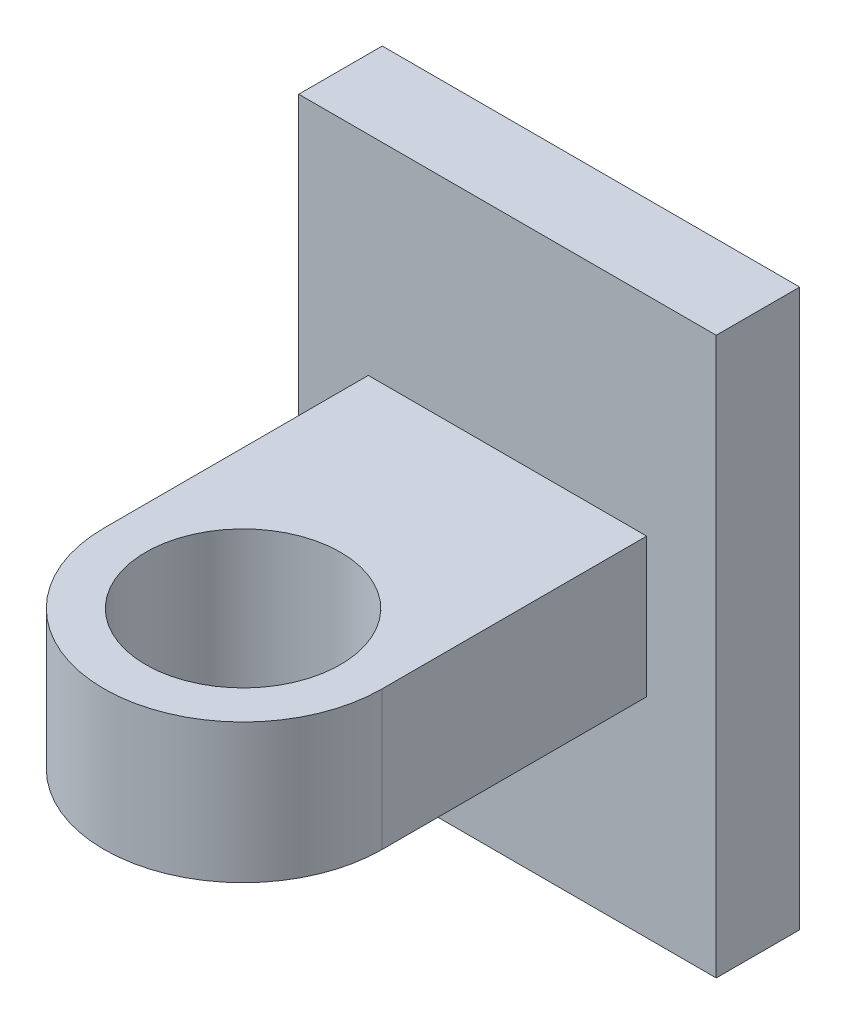
ISO-10303-21;
HEADER;
FILE_DESCRIPTION(('STEP AP214'),'2;1');
FILE_NAME('part.step','',(''),(''),'','','');
FILE_SCHEMA(('AUTOMOTIVE_DESIGN { 1 0 10303 214 1 1 1 1 }'));
ENDSEC;
DATA;
#1=APPLICATION_CONTEXT('core data for automotive mechanical design processes');
#2=APPLICATION_PROTOCOL_DEFINITION('international standard','automotive_design',2000,#1);
#3=PRODUCT_CONTEXT('',#1,'mechanical');
#4=PRODUCT('Part','Part','',(#3));
#5=PRODUCT_RELATED_PRODUCT_CATEGORY('part','',(#4));
#6=PRODUCT_DEFINITION_FORMATION('','',#4);
#7=PRODUCT_DEFINITION_CONTEXT('part definition',#1,'design');
#8=PRODUCT_DEFINITION('design','',#6,#7);
#9=PRODUCT_DEFINITION_SHAPE('','',#8);
#10=(LENGTH_UNIT() NAMED_UNIT(*) SI_UNIT(.MILLI.,.METRE.));
#11=(NAMED_UNIT(*) PLANE_ANGLE_UNIT() SI_UNIT($,.RADIAN.));
#12=(NAMED_UNIT(*) SI_UNIT($,.STERADIAN.) SOLID_ANGLE_UNIT());
#13=UNCERTAINTY_MEASURE_WITH_UNIT(LENGTH_MEASURE(1.E-05),#10,'distance_accuracy_value','');
#14=(GEOMETRIC_REPRESENTATION_CONTEXT(3) GLOBAL_UNCERTAINTY_ASSIGNED_CONTEXT((#13)) GLOBAL_UNIT_ASSIGNED_CONTEXT((#10,
#11,#12)) REPRESENTATION_CONTEXT('',''));
#15=CARTESIAN_POINT('',(0.,0.,0.));
#16=DIRECTION('',(0.,0.,1.));
#17=DIRECTION('',(1.,0.,0.));
#18=AXIS2_PLACEMENT_3D('',#15,#16,#17);
#19=CARTESIAN_POINT('',(0.,0.,3.));
#20=DIRECTION('',(0.,0.,1.));
#21=DIRECTION('',(1.,0.,0.));
#22=AXIS2_PLACEMENT_3D('',#19,#20,#21);
#23=PLANE('',#22);
#24=DIRECTION('',(0.,1.,0.));
#25=VECTOR('',#24,1.);
#26=CARTESIAN_POINT('',(7.5,10.,3.));
#27=LINE('',#26,#25);
#28=CARTESIAN_POINT('',(7.5,-10.,3.));
#29=VERTEX_POINT('',#28);
#30=CARTESIAN_POINT('',(7.5,10.,3.));
#31=VERTEX_POINT('',#30);
#32=EDGE_CURVE('E153',#29,#31,#27,.T.);
#33=ORIENTED_EDGE('',*,*,#32,.T.);
#34=DIRECTION('',(-1.,0.,0.));
#35=VECTOR('',#34,1.);
#36=CARTESIAN_POINT('',(-7.50000000000001,10.,3.));
#37=LINE('',#36,#35);
#38=CARTESIAN_POINT('',(-7.50000000000001,10.,3.));
#39=VERTEX_POINT('',#38);
#40=EDGE_CURVE('E92',#31,#39,#37,.T.);
#41=ORIENTED_EDGE('',*,*,#40,.T.);
#42=DIRECTION('',(0.,-1.,0.));
#43=VECTOR('',#42,1.);
#44=CARTESIAN_POINT('',(-7.50000000000001,10.,3.));
#45=LINE('',#44,#43);
#46=CARTESIAN_POINT('',(-7.5,-10.,3.));
#47=VERTEX_POINT('',#46);
#48=EDGE_CURVE('E158',#39,#47,#45,.T.);
#49=ORIENTED_EDGE('',*,*,#48,.T.);
#50=DIRECTION('',(1.,0.,0.));
#51=VECTOR('',#50,1.);
#52=CARTESIAN_POINT('',(-7.5,-10.,3.));
#53=LINE('',#52,#51);
#54=EDGE_CURVE('E64',#47,#29,#53,.T.);
#55=ORIENTED_EDGE('',*,*,#54,.T.);
#56=EDGE_LOOP('',(#33,#41,#49,#55));
#57=FACE_BOUND('',#56,.T.);
#58=DIRECTION('',(0.,-1.,0.));
#59=VECTOR('',#58,1.);
#60=CARTESIAN_POINT('',(5.,2.5,3.));
#61=LINE('',#60,#59);
#62=CARTESIAN_POINT('',(5.,2.5,3.));
#63=VERTEX_POINT('',#62);
#64=CARTESIAN_POINT('',(5.,-2.5,3.));
#65=VERTEX_POINT('',#64);
#66=EDGE_CURVE('E149',#63,#65,#61,.T.);
#67=ORIENTED_EDGE('',*,*,#66,.T.);
#68=DIRECTION('',(-1.,0.,0.));
#69=VECTOR('',#68,1.);
#70=CARTESIAN_POINT('',(-5.,-2.5,3.));
#71=LINE('',#70,#69);
#72=CARTESIAN_POINT('',(-5.,-2.5,3.));
#73=VERTEX_POINT('',#72);
#74=EDGE_CURVE('E55',#65,#73,#71,.T.);
#75=ORIENTED_EDGE('',*,*,#74,.T.);
#76=DIRECTION('',(0.,-1.,0.));
#77=VECTOR('',#76,1.);
#78=CARTESIAN_POINT('',(-5.,2.5,3.));
#79=LINE('',#78,#77);
#80=CARTESIAN_POINT('',(-5.,2.5,3.));
#81=VERTEX_POINT('',#80);
#82=EDGE_CURVE('E240',#81,#73,#79,.T.);
#83=ORIENTED_EDGE('',*,*,#82,.F.);
#84=DIRECTION('',(-1.,0.,0.));
#85=VECTOR('',#84,1.);
#86=CARTESIAN_POINT('',(-5.,2.5,3.));
#87=LINE('',#86,#85);
#88=EDGE_CURVE('E134',#63,#81,#87,.T.);
#89=ORIENTED_EDGE('',*,*,#88,.F.);
#90=EDGE_LOOP('',(#67,#75,#83,#89));
#91=FACE_BOUND('',#90,.T.);
#92=ADVANCED_FACE('F39',(#57,#91),#23,.T.);
#93=CARTESIAN_POINT('',(7.5,10.,3.));
#94=DIRECTION('',(-1.,0.,0.));
#95=DIRECTION('',(0.,-1.,0.));
#96=AXIS2_PLACEMENT_3D('',#93,#94,#95);
#97=PLANE('',#96);
#98=DIRECTION('',(0.,1.,0.));
#99=VECTOR('',#98,1.);
#100=CARTESIAN_POINT('',(7.5,10.,0.));
#101=LINE('',#100,#99);
#102=CARTESIAN_POINT('',(7.5,-10.,0.));
#103=VERTEX_POINT('',#102);
#104=CARTESIAN_POINT('',(7.5,10.,0.));
#105=VERTEX_POINT('',#104);
#106=EDGE_CURVE('E142',#103,#105,#101,.T.);
#107=ORIENTED_EDGE('',*,*,#106,.T.);
#108=DIRECTION('',(0.,0.,-1.));
#109=VECTOR('',#108,1.);
#110=CARTESIAN_POINT('',(7.5,10.,3.));
#111=LINE('',#110,#109);
#112=EDGE_CURVE('E11',#31,#105,#111,.T.);
#113=ORIENTED_EDGE('',*,*,#112,.F.);
#114=ORIENTED_EDGE('',*,*,#32,.F.);
#115=DIRECTION('',(0.,0.,-1.));
#116=VECTOR('',#115,1.);
#117=CARTESIAN_POINT('',(7.5,-10.,3.));
#118=LINE('',#117,#116);
#119=EDGE_CURVE('E162',#29,#103,#118,.T.);
#120=ORIENTED_EDGE('',*,*,#119,.T.);
#121=EDGE_LOOP('',(#107,#113,#114,#120));
#122=FACE_BOUND('',#121,.T.);
#123=ADVANCED_FACE('F41',(#122),#97,.F.);
#124=CARTESIAN_POINT('',(-7.50000000000001,10.,3.));
#125=DIRECTION('',(0.,-1.,0.));
#126=DIRECTION('',(0.,0.,-1.));
#127=AXIS2_PLACEMENT_3D('',#124,#125,#126);
#128=PLANE('',#127);
#129=DIRECTION('',(-1.,0.,0.));
#130=VECTOR('',#129,1.);
#131=CARTESIAN_POINT('',(-7.50000000000001,10.,0.));
#132=LINE('',#131,#130);
#133=CARTESIAN_POINT('',(-7.50000000000001,10.,0.));
#134=VERTEX_POINT('',#133);
#135=EDGE_CURVE('E147',#105,#134,#132,.T.);
#136=ORIENTED_EDGE('',*,*,#135,.T.);
#137=DIRECTION('',(0.,0.,-1.));
#138=VECTOR('',#137,1.);
#139=CARTESIAN_POINT('',(-7.50000000000001,10.,3.));
#140=LINE('',#139,#138);
#141=EDGE_CURVE('E48',#39,#134,#140,.T.);
#142=ORIENTED_EDGE('',*,*,#141,.F.);
#143=ORIENTED_EDGE('',*,*,#40,.F.);
#144=ORIENTED_EDGE('',*,*,#112,.T.);
#145=EDGE_LOOP('',(#136,#142,#143,#144));
#146=FACE_BOUND('',#145,.T.);
#147=ADVANCED_FACE('F196',(#146),#128,.F.);
#148=CARTESIAN_POINT('',(-7.50000000000001,10.,3.));
#149=DIRECTION('',(1.,0.,0.));
#150=DIRECTION('',(0.,1.,0.));
#151=AXIS2_PLACEMENT_3D('',#148,#149,#150);
#152=PLANE('',#151);
#153=DIRECTION('',(0.,-1.,0.));
#154=VECTOR('',#153,1.);
#155=CARTESIAN_POINT('',(-7.50000000000001,10.,0.));
#156=LINE('',#155,#154);
#157=CARTESIAN_POINT('',(-7.5,-10.,0.));
#158=VERTEX_POINT('',#157);
#159=EDGE_CURVE('E166',#134,#158,#156,.T.);
#160=ORIENTED_EDGE('',*,*,#159,.T.);
#161=DIRECTION('',(0.,0.,-1.));
#162=VECTOR('',#161,1.);
#163=CARTESIAN_POINT('',(-7.5,-10.,3.));
#164=LINE('',#163,#162);
#165=EDGE_CURVE('E173',#47,#158,#164,.T.);
#166=ORIENTED_EDGE('',*,*,#165,.F.);
#167=ORIENTED_EDGE('',*,*,#48,.F.);
#168=ORIENTED_EDGE('',*,*,#141,.T.);
#169=EDGE_LOOP('',(#160,#166,#167,#168));
#170=FACE_BOUND('',#169,.T.);
#171=ADVANCED_FACE('F180',(#170),#152,.F.);
#172=CARTESIAN_POINT('',(-7.5,-10.,3.));
#173=DIRECTION('',(0.,1.,0.));
#174=DIRECTION('',(0.,0.,1.));
#175=AXIS2_PLACEMENT_3D('',#172,#173,#174);
#176=PLANE('',#175);
#177=DIRECTION('',(1.,0.,0.));
#178=VECTOR('',#177,1.);
#179=CARTESIAN_POINT('',(-7.5,-10.,0.));
#180=LINE('',#179,#178);
#181=EDGE_CURVE('E85',#158,#103,#180,.T.);
#182=ORIENTED_EDGE('',*,*,#181,.T.);
#183=ORIENTED_EDGE('',*,*,#119,.F.);
#184=ORIENTED_EDGE('',*,*,#54,.F.);
#185=ORIENTED_EDGE('',*,*,#165,.T.);
#186=EDGE_LOOP('',(#182,#183,#184,#185));
#187=FACE_BOUND('',#186,.T.);
#188=ADVANCED_FACE('F188',(#187),#176,.F.);
#189=CARTESIAN_POINT('',(0.,0.,0.));
#190=DIRECTION('',(0.,0.,1.));
#191=DIRECTION('',(1.,0.,0.));
#192=AXIS2_PLACEMENT_3D('',#189,#190,#191);
#193=PLANE('',#192);
#194=ORIENTED_EDGE('',*,*,#106,.F.);
#195=ORIENTED_EDGE('',*,*,#181,.F.);
#196=ORIENTED_EDGE('',*,*,#159,.F.);
#197=ORIENTED_EDGE('',*,*,#135,.F.);
#198=EDGE_LOOP('',(#194,#195,#196,#197));
#199=FACE_BOUND('',#198,.T.);
#200=ADVANCED_FACE('F184',(#199),#193,.F.);
#201=CARTESIAN_POINT('',(0.,2.5,12.5));
#202=DIRECTION('',(0.,-1.,0.));
#203=DIRECTION('',(0.,0.,-1.));
#204=AXIS2_PLACEMENT_3D('',#201,#202,#203);
#205=PLANE('',#204);
#206=DIRECTION('',(0.,0.,1.));
#207=VECTOR('',#206,1.);
#208=CARTESIAN_POINT('',(-5.,2.5,3.));
#209=LINE('',#208,#207);
#210=CARTESIAN_POINT('',(-5.,2.5,12.5));
#211=VERTEX_POINT('',#210);
#212=EDGE_CURVE('E128',#81,#211,#209,.T.);
#213=ORIENTED_EDGE('',*,*,#212,.T.);
#214=CARTESIAN_POINT('',(0.,2.5,12.5));
#215=DIRECTION('',(0.,1.,0.));
#216=DIRECTION('',(0.,0.,-1.));
#217=AXIS2_PLACEMENT_3D('',#214,#215,#216);
#218=CIRCLE('',#217,5.);
#219=CARTESIAN_POINT('',(5.,2.5,12.5));
#220=VERTEX_POINT('',#219);
#221=EDGE_CURVE('E116',#211,#220,#218,.T.);
#222=ORIENTED_EDGE('',*,*,#221,.T.);
#223=DIRECTION('',(0.,0.,-1.));
#224=VECTOR('',#223,1.);
#225=CARTESIAN_POINT('',(5.,2.5,3.));
#226=LINE('',#225,#224);
#227=EDGE_CURVE('E127',#220,#63,#226,.T.);
#228=ORIENTED_EDGE('',*,*,#227,.T.);
#229=ORIENTED_EDGE('',*,*,#88,.T.);
#230=EDGE_LOOP('',(#213,#222,#228,#229));
#231=FACE_BOUND('',#230,.T.);
#232=CARTESIAN_POINT('',(0.,2.5,12.5));
#233=DIRECTION('',(0.,1.,0.));
#234=DIRECTION('',(0.,0.,1.));
#235=AXIS2_PLACEMENT_3D('',#232,#233,#234);
#236=CIRCLE('',#235,3.5);
#237=CARTESIAN_POINT('',(0.,2.5,16.));
#238=VERTEX_POINT('',#237);
#239=EDGE_CURVE('E226',#238,#238,#236,.T.);
#240=ORIENTED_EDGE('',*,*,#239,.F.);
#241=EDGE_LOOP('',(#240));
#242=FACE_BOUND('',#241,.T.);
#243=ADVANCED_FACE('F131',(#231,#242),#205,.F.);
#244=CARTESIAN_POINT('',(0.,-2.5,12.5));
#245=DIRECTION('',(0.,-1.,0.));
#246=DIRECTION('',(0.,0.,-1.));
#247=AXIS2_PLACEMENT_3D('',#244,#245,#246);
#248=PLANE('',#247);
#249=DIRECTION('',(0.,0.,1.));
#250=VECTOR('',#249,1.);
#251=CARTESIAN_POINT('',(-5.,-2.5,3.));
#252=LINE('',#251,#250);
#253=CARTESIAN_POINT('',(-5.,-2.5,12.5));
#254=VERTEX_POINT('',#253);
#255=EDGE_CURVE('E140',#73,#254,#252,.T.);
#256=ORIENTED_EDGE('',*,*,#255,.F.);
#257=ORIENTED_EDGE('',*,*,#74,.F.);
#258=DIRECTION('',(0.,0.,-1.));
#259=VECTOR('',#258,1.);
#260=CARTESIAN_POINT('',(5.,-2.5,3.));
#261=LINE('',#260,#259);
#262=CARTESIAN_POINT('',(5.,-2.5,12.5));
#263=VERTEX_POINT('',#262);
#264=EDGE_CURVE('E246',#263,#65,#261,.T.);
#265=ORIENTED_EDGE('',*,*,#264,.F.);
#266=CARTESIAN_POINT('',(0.,-2.5,12.5));
#267=DIRECTION('',(0.,1.,0.));
#268=DIRECTION('',(0.,0.,-1.));
#269=AXIS2_PLACEMENT_3D('',#266,#267,#268);
#270=CIRCLE('',#269,5.);
#271=EDGE_CURVE('E243',#254,#263,#270,.T.);
#272=ORIENTED_EDGE('',*,*,#271,.F.);
#273=EDGE_LOOP('',(#256,#257,#265,#272));
#274=FACE_BOUND('',#273,.T.);
#275=CARTESIAN_POINT('',(0.,-2.5,12.5));
#276=DIRECTION('',(0.,1.,0.));
#277=DIRECTION('',(0.,0.,1.));
#278=AXIS2_PLACEMENT_3D('',#275,#276,#277);
#279=CIRCLE('',#278,3.5);
#280=CARTESIAN_POINT('',(0.,-2.5,16.));
#281=VERTEX_POINT('',#280);
#282=EDGE_CURVE('E229',#281,#281,#279,.T.);
#283=ORIENTED_EDGE('',*,*,#282,.T.);
#284=EDGE_LOOP('',(#283));
#285=FACE_BOUND('',#284,.T.);
#286=ADVANCED_FACE('F207',(#274,#285),#248,.T.);
#287=CARTESIAN_POINT('',(-5.,2.5,3.));
#288=DIRECTION('',(1.,0.,0.));
#289=DIRECTION('',(0.,0.,-1.));
#290=AXIS2_PLACEMENT_3D('',#287,#288,#289);
#291=PLANE('',#290);
#292=ORIENTED_EDGE('',*,*,#255,.T.);
#293=DIRECTION('',(0.,-1.,0.));
#294=VECTOR('',#293,1.);
#295=CARTESIAN_POINT('',(-5.,2.5,12.5));
#296=LINE('',#295,#294);
#297=EDGE_CURVE('E120',#211,#254,#296,.T.);
#298=ORIENTED_EDGE('',*,*,#297,.F.);
#299=ORIENTED_EDGE('',*,*,#212,.F.);
#300=ORIENTED_EDGE('',*,*,#82,.T.);
#301=EDGE_LOOP('',(#292,#298,#299,#300));
#302=FACE_BOUND('',#301,.T.);
#303=ADVANCED_FACE('F139',(#302),#291,.F.);
#304=CARTESIAN_POINT('',(0.,2.5,12.5));
#305=DIRECTION('',(0.,-1.,0.));
#306=DIRECTION('',(0.,0.,-1.));
#307=AXIS2_PLACEMENT_3D('',#304,#305,#306);
#308=CYLINDRICAL_SURFACE('',#307,5.);
#309=ORIENTED_EDGE('',*,*,#271,.T.);
#310=DIRECTION('',(0.,-1.,0.));
#311=VECTOR('',#310,1.);
#312=CARTESIAN_POINT('',(5.,2.5,12.5));
#313=LINE('',#312,#311);
#314=EDGE_CURVE('E123',#220,#263,#313,.T.);
#315=ORIENTED_EDGE('',*,*,#314,.F.);
#316=ORIENTED_EDGE('',*,*,#221,.F.);
#317=ORIENTED_EDGE('',*,*,#297,.T.);
#318=EDGE_LOOP('',(#309,#315,#316,#317));
#319=FACE_BOUND('',#318,.T.);
#320=ADVANCED_FACE('F118',(#319),#308,.T.);
#321=CARTESIAN_POINT('',(5.,2.5,3.));
#322=DIRECTION('',(-1.,0.,0.));
#323=DIRECTION('',(0.,0.,1.));
#324=AXIS2_PLACEMENT_3D('',#321,#322,#323);
#325=PLANE('',#324);
#326=ORIENTED_EDGE('',*,*,#264,.T.);
#327=ORIENTED_EDGE('',*,*,#66,.F.);
#328=ORIENTED_EDGE('',*,*,#227,.F.);
#329=ORIENTED_EDGE('',*,*,#314,.T.);
#330=EDGE_LOOP('',(#326,#327,#328,#329));
#331=FACE_BOUND('',#330,.T.);
#332=ADVANCED_FACE('F210',(#331),#325,.F.);
#333=CARTESIAN_POINT('',(0.,2.5,12.5));
#334=DIRECTION('',(0.,-1.,0.));
#335=DIRECTION('',(0.,0.,-1.));
#336=AXIS2_PLACEMENT_3D('',#333,#334,#335);
#337=CYLINDRICAL_SURFACE('',#336,3.5);
#338=ORIENTED_EDGE('',*,*,#239,.T.);
#339=EDGE_LOOP('',(#338));
#340=FACE_BOUND('',#339,.T.);
#341=ORIENTED_EDGE('',*,*,#282,.F.);
#342=EDGE_LOOP('',(#341));
#343=FACE_BOUND('',#342,.T.);
#344=ADVANCED_FACE('F213',(#340,#343),#337,.F.);
#345=CLOSED_SHELL('',(#92,#123,#147,#171,#188,#200,#243,#286,#303,#320,#332,#344));
#346=MANIFOLD_SOLID_BREP('B2',#345);
#347=ADVANCED_BREP_SHAPE_REPRESENTATION('',(#18,#346),#14);
#348=SHAPE_DEFINITION_REPRESENTATION(#9,#347);
ENDSEC;
END-ISO-10303-21;
